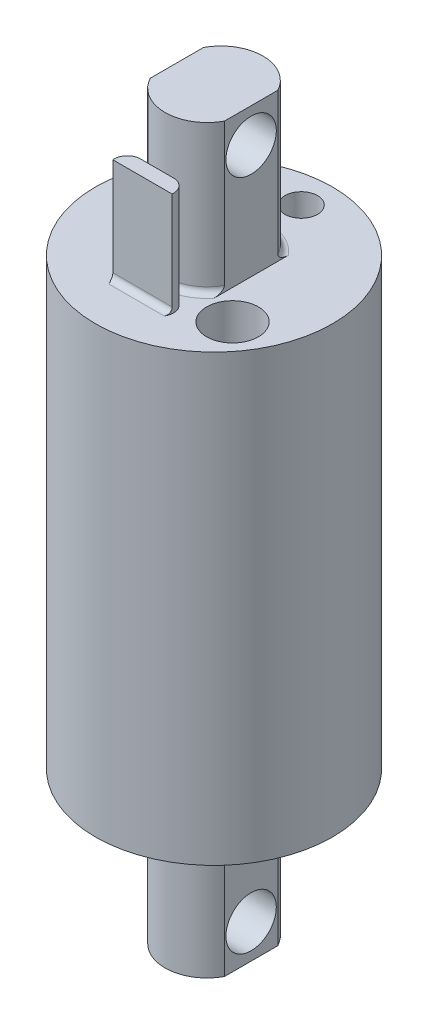
ISO-10303-21;
HEADER;
FILE_DESCRIPTION(('STEP AP214'),'2;1');
FILE_NAME('part.step','',(''),(''),'','','');
FILE_SCHEMA(('AUTOMOTIVE_DESIGN { 1 0 10303 214 1 1 1 1 }'));
ENDSEC;
DATA;
#1=APPLICATION_CONTEXT('core data for automotive mechanical design processes');
#2=APPLICATION_PROTOCOL_DEFINITION('international standard','automotive_design',2000,#1);
#3=PRODUCT_CONTEXT('',#1,'mechanical');
#4=PRODUCT('Part','Part','',(#3));
#5=PRODUCT_RELATED_PRODUCT_CATEGORY('part','',(#4));
#6=PRODUCT_DEFINITION_FORMATION('','',#4);
#7=PRODUCT_DEFINITION_CONTEXT('part definition',#1,'design');
#8=PRODUCT_DEFINITION('design','',#6,#7);
#9=PRODUCT_DEFINITION_SHAPE('','',#8);
#10=(LENGTH_UNIT() NAMED_UNIT(*) SI_UNIT(.MILLI.,.METRE.));
#11=(NAMED_UNIT(*) PLANE_ANGLE_UNIT() SI_UNIT($,.RADIAN.));
#12=(NAMED_UNIT(*) SI_UNIT($,.STERADIAN.) SOLID_ANGLE_UNIT());
#13=UNCERTAINTY_MEASURE_WITH_UNIT(LENGTH_MEASURE(1.E-05),#10,'distance_accuracy_value','');
#14=(GEOMETRIC_REPRESENTATION_CONTEXT(3) GLOBAL_UNCERTAINTY_ASSIGNED_CONTEXT((#13)) GLOBAL_UNIT_ASSIGNED_CONTEXT((#10,
#11,#12)) REPRESENTATION_CONTEXT('',''));
#15=CARTESIAN_POINT('',(0.,0.,0.));
#16=DIRECTION('',(0.,0.,1.));
#17=DIRECTION('',(1.,0.,0.));
#18=AXIS2_PLACEMENT_3D('',#15,#16,#17);
#19=CARTESIAN_POINT('',(0.,30.,0.));
#20=DIRECTION('',(0.,1.,0.));
#21=DIRECTION('',(0.,0.,1.));
#22=AXIS2_PLACEMENT_3D('',#19,#20,#21);
#23=PLANE('',#22);
#24=CARTESIAN_POINT('',(4.51132396785041,30.,3.26045686767382));
#25=DIRECTION('',(0.,1.,0.));
#26=DIRECTION('',(0.,0.,1.));
#27=AXIS2_PLACEMENT_3D('',#24,#25,#26);
#28=CIRCLE('',#27,1.75);
#29=CARTESIAN_POINT('',(4.51132396785041,30.,5.01045686767382));
#30=VERTEX_POINT('',#29);
#31=EDGE_CURVE('E203',#30,#30,#28,.F.);
#32=ORIENTED_EDGE('',*,*,#31,.T.);
#33=EDGE_LOOP('',(#32));
#34=FACE_BOUND('',#33,.T.);
#35=CARTESIAN_POINT('',(0.,30.,-5.88785777853596));
#36=DIRECTION('',(0.,1.,0.));
#37=DIRECTION('',(0.,0.,1.));
#38=AXIS2_PLACEMENT_3D('',#35,#36,#37);
#39=CIRCLE('',#38,1.1);
#40=CARTESIAN_POINT('',(0.,30.,-4.78785777853596));
#41=VERTEX_POINT('',#40);
#42=EDGE_CURVE('E197',#41,#41,#39,.F.);
#43=ORIENTED_EDGE('',*,*,#42,.T.);
#44=EDGE_LOOP('',(#43));
#45=FACE_BOUND('',#44,.T.);
#46=DIRECTION('',(0.,0.,1.));
#47=VECTOR('',#46,1.);
#48=CARTESIAN_POINT('',(-2.50450289239268,30.,1.8));
#49=LINE('',#48,#47);
#50=CARTESIAN_POINT('',(-2.50450289239268,30.,-2.51728401601636));
#51=VERTEX_POINT('',#50);
#52=CARTESIAN_POINT('',(-2.50450289239268,30.,2.51728401601636));
#53=VERTEX_POINT('',#52);
#54=EDGE_CURVE('E233',#51,#53,#49,.T.);
#55=ORIENTED_EDGE('',*,*,#54,.F.);
#56=CARTESIAN_POINT('',(0.,30.,-0.464217512733279));
#57=DIRECTION('',(0.,1.,0.));
#58=DIRECTION('',(0.,0.,1.));
#59=AXIS2_PLACEMENT_3D('',#56,#57,#58);
#60=CIRCLE('',#59,3.23845901701817);
#61=CARTESIAN_POINT('',(2.50450289239268,30.,-2.51728401601636));
#62=VERTEX_POINT('',#61);
#63=EDGE_CURVE('E269',#51,#62,#60,.F.);
#64=ORIENTED_EDGE('',*,*,#63,.T.);
#65=DIRECTION('',(0.,0.,-1.));
#66=VECTOR('',#65,1.);
#67=CARTESIAN_POINT('',(2.50450289239268,30.,1.8));
#68=LINE('',#67,#66);
#69=CARTESIAN_POINT('',(2.50450289239268,30.,2.51728401601636));
#70=VERTEX_POINT('',#69);
#71=EDGE_CURVE('E238',#70,#62,#68,.T.);
#72=ORIENTED_EDGE('',*,*,#71,.F.);
#73=CARTESIAN_POINT('',(0.,30.,0.464217512733279));
#74=DIRECTION('',(0.,1.,0.));
#75=DIRECTION('',(0.,0.,1.));
#76=AXIS2_PLACEMENT_3D('',#73,#74,#75);
#77=CIRCLE('',#76,3.23845901701817);
#78=EDGE_CURVE('E266',#70,#53,#77,.F.);
#79=ORIENTED_EDGE('',*,*,#78,.T.);
#80=EDGE_LOOP('',(#55,#64,#72,#79));
#81=FACE_BOUND('',#80,.T.);
#82=CARTESIAN_POINT('',(0.,30.,0.));
#83=DIRECTION('',(0.,1.,0.));
#84=DIRECTION('',(0.,0.,1.));
#85=AXIS2_PLACEMENT_3D('',#82,#83,#84);
#86=CIRCLE('',#85,8.);
#87=CARTESIAN_POINT('',(0.,30.,8.));
#88=VERTEX_POINT('',#87);
#89=EDGE_CURVE('E258',#88,#88,#86,.T.);
#90=ORIENTED_EDGE('',*,*,#89,.T.);
#91=EDGE_LOOP('',(#90));
#92=FACE_BOUND('',#91,.T.);
#93=CARTESIAN_POINT('',(1.10865637260195,30.,4.73538494762983));
#94=DIRECTION('',(0.,1.,0.));
#95=DIRECTION('',(0.,0.,-1.));
#96=AXIS2_PLACEMENT_3D('',#93,#94,#95);
#97=CIRCLE('',#96,0.896011785842879);
#98=CARTESIAN_POINT('',(1.85793506586946,30.,5.22672857502788));
#99=VERTEX_POINT('',#98);
#100=CARTESIAN_POINT('',(1.2,30.,3.84404132023178));
#101=VERTEX_POINT('',#100);
#102=EDGE_CURVE('E206',#99,#101,#97,.T.);
#103=ORIENTED_EDGE('',*,*,#102,.F.);
#104=DIRECTION('',(1.,0.,0.));
#105=VECTOR('',#104,1.);
#106=CARTESIAN_POINT('',(0.,30.,5.22672857502788));
#107=LINE('',#106,#105);
#108=CARTESIAN_POINT('',(-1.85793506586946,30.,5.22672857502788));
#109=VERTEX_POINT('',#108);
#110=EDGE_CURVE('E272',#99,#109,#107,.F.);
#111=ORIENTED_EDGE('',*,*,#110,.T.);
#112=CARTESIAN_POINT('',(-1.10865637260195,30.,4.73538494762983));
#113=DIRECTION('',(0.,1.,0.));
#114=DIRECTION('',(0.,0.,1.));
#115=AXIS2_PLACEMENT_3D('',#112,#113,#114);
#116=CIRCLE('',#115,0.896011785842879);
#117=CARTESIAN_POINT('',(-1.2,30.,3.84404132023178));
#118=VERTEX_POINT('',#117);
#119=EDGE_CURVE('E211',#118,#109,#116,.T.);
#120=ORIENTED_EDGE('',*,*,#119,.F.);
#121=DIRECTION('',(-1.,0.,0.));
#122=VECTOR('',#121,1.);
#123=CARTESIAN_POINT('',(-1.2,30.,3.84404132023178));
#124=LINE('',#123,#122);
#125=EDGE_CURVE('E220',#101,#118,#124,.T.);
#126=ORIENTED_EDGE('',*,*,#125,.F.);
#127=EDGE_LOOP('',(#103,#111,#120,#126));
#128=FACE_BOUND('',#127,.T.);
#129=ADVANCED_FACE('F43',(#34,#45,#81,#92,#128),#23,.T.);
#130=CARTESIAN_POINT('',(0.,30.,0.));
#131=DIRECTION('',(0.,-1.,0.));
#132=DIRECTION('',(0.,0.,-1.));
#133=AXIS2_PLACEMENT_3D('',#130,#131,#132);
#134=CYLINDRICAL_SURFACE('',#133,8.);
#135=ORIENTED_EDGE('',*,*,#89,.F.);
#136=EDGE_LOOP('',(#135));
#137=FACE_BOUND('',#136,.T.);
#138=CARTESIAN_POINT('',(0.,0.,0.));
#139=DIRECTION('',(0.,1.,0.));
#140=DIRECTION('',(0.,0.,1.));
#141=AXIS2_PLACEMENT_3D('',#138,#139,#140);
#142=CIRCLE('',#141,8.);
#143=CARTESIAN_POINT('',(0.,0.,8.));
#144=VERTEX_POINT('',#143);
#145=EDGE_CURVE('E257',#144,#144,#142,.T.);
#146=ORIENTED_EDGE('',*,*,#145,.T.);
#147=EDGE_LOOP('',(#146));
#148=FACE_BOUND('',#147,.T.);
#149=ADVANCED_FACE('F308',(#137,#148),#134,.T.);
#150=CARTESIAN_POINT('',(0.,0.,0.));
#151=DIRECTION('',(0.,1.,0.));
#152=DIRECTION('',(0.,0.,1.));
#153=AXIS2_PLACEMENT_3D('',#150,#151,#152);
#154=PLANE('',#153);
#155=DIRECTION('',(0.,0.,-1.));
#156=VECTOR('',#155,1.);
#157=CARTESIAN_POINT('',(2.50450289239268,0.,1.8));
#158=LINE('',#157,#156);
#159=CARTESIAN_POINT('',(2.50450289239268,0.,1.8));
#160=VERTEX_POINT('',#159);
#161=CARTESIAN_POINT('',(2.50450289239268,0.,-1.8));
#162=VERTEX_POINT('',#161);
#163=EDGE_CURVE('E180',#160,#162,#158,.T.);
#164=ORIENTED_EDGE('',*,*,#163,.T.);
#165=CARTESIAN_POINT('',(0.,0.,-0.464217512733279));
#166=DIRECTION('',(0.,1.,0.));
#167=DIRECTION('',(0.,0.,-1.));
#168=AXIS2_PLACEMENT_3D('',#165,#166,#167);
#169=CIRCLE('',#168,2.83845901701817);
#170=CARTESIAN_POINT('',(-2.50450289239268,0.,-1.8));
#171=VERTEX_POINT('',#170);
#172=EDGE_CURVE('E60',#162,#171,#169,.T.);
#173=ORIENTED_EDGE('',*,*,#172,.T.);
#174=DIRECTION('',(0.,0.,1.));
#175=VECTOR('',#174,1.);
#176=CARTESIAN_POINT('',(-2.50450289239268,0.,1.8));
#177=LINE('',#176,#175);
#178=CARTESIAN_POINT('',(-2.50450289239268,0.,1.8));
#179=VERTEX_POINT('',#178);
#180=EDGE_CURVE('E169',#171,#179,#177,.T.);
#181=ORIENTED_EDGE('',*,*,#180,.T.);
#182=CARTESIAN_POINT('',(0.,0.,0.464217512733279));
#183=DIRECTION('',(0.,1.,0.));
#184=DIRECTION('',(0.,0.,1.));
#185=AXIS2_PLACEMENT_3D('',#182,#183,#184);
#186=CIRCLE('',#185,2.83845901701817);
#187=EDGE_CURVE('E183',#179,#160,#186,.T.);
#188=ORIENTED_EDGE('',*,*,#187,.T.);
#189=EDGE_LOOP('',(#164,#173,#181,#188));
#190=FACE_BOUND('',#189,.T.);
#191=CARTESIAN_POINT('',(4.51132396785041,0.,3.26045686767382));
#192=DIRECTION('',(0.,1.,0.));
#193=DIRECTION('',(0.,0.,1.));
#194=AXIS2_PLACEMENT_3D('',#191,#192,#193);
#195=CIRCLE('',#194,1.75);
#196=CARTESIAN_POINT('',(4.51132396785041,0.,5.01045686767382));
#197=VERTEX_POINT('',#196);
#198=EDGE_CURVE('E194',#197,#197,#195,.T.);
#199=ORIENTED_EDGE('',*,*,#198,.T.);
#200=EDGE_LOOP('',(#199));
#201=FACE_BOUND('',#200,.T.);
#202=CARTESIAN_POINT('',(0.,0.,-5.88785777853596));
#203=DIRECTION('',(0.,1.,0.));
#204=DIRECTION('',(0.,0.,1.));
#205=AXIS2_PLACEMENT_3D('',#202,#203,#204);
#206=CIRCLE('',#205,1.1);
#207=CARTESIAN_POINT('',(0.,0.,-4.78785777853596));
#208=VERTEX_POINT('',#207);
#209=EDGE_CURVE('E198',#208,#208,#206,.T.);
#210=ORIENTED_EDGE('',*,*,#209,.T.);
#211=EDGE_LOOP('',(#210));
#212=FACE_BOUND('',#211,.T.);
#213=ORIENTED_EDGE('',*,*,#145,.F.);
#214=EDGE_LOOP('',(#213));
#215=FACE_BOUND('',#214,.T.);
#216=ADVANCED_FACE('F356',(#190,#201,#212,#215),#154,.F.);
#217=CARTESIAN_POINT('',(0.,40.,-0.464217512733279));
#218=DIRECTION('',(0.,-1.,0.));
#219=DIRECTION('',(0.,0.,-1.));
#220=AXIS2_PLACEMENT_3D('',#217,#218,#219);
#221=CYLINDRICAL_SURFACE('',#220,2.83845901701817);
#222=DIRECTION('',(0.,-1.,0.));
#223=VECTOR('',#222,1.);
#224=CARTESIAN_POINT('',(2.50450289239268,40.,-1.8));
#225=LINE('',#224,#223);
#226=CARTESIAN_POINT('',(2.50450289239268,40.,-1.8));
#227=VERTEX_POINT('',#226);
#228=CARTESIAN_POINT('',(2.50450289239268,30.4,-1.8));
#229=VERTEX_POINT('',#228);
#230=EDGE_CURVE('E244',#227,#229,#225,.T.);
#231=ORIENTED_EDGE('',*,*,#230,.T.);
#232=CARTESIAN_POINT('',(0.,30.4,-0.464217512733279));
#233=DIRECTION('',(0.,1.,0.));
#234=DIRECTION('',(0.,0.,1.));
#235=AXIS2_PLACEMENT_3D('',#232,#233,#234);
#236=CIRCLE('',#235,2.83845901701817);
#237=CARTESIAN_POINT('',(-2.50450289239268,30.4,-1.8));
#238=VERTEX_POINT('',#237);
#239=EDGE_CURVE('E275',#229,#238,#236,.T.);
#240=ORIENTED_EDGE('',*,*,#239,.T.);
#241=DIRECTION('',(0.,-1.,0.));
#242=VECTOR('',#241,1.);
#243=CARTESIAN_POINT('',(-2.50450289239268,40.,-1.8));
#244=LINE('',#243,#242);
#245=CARTESIAN_POINT('',(-2.50450289239268,40.,-1.8));
#246=VERTEX_POINT('',#245);
#247=EDGE_CURVE('E254',#246,#238,#244,.T.);
#248=ORIENTED_EDGE('',*,*,#247,.F.);
#249=CARTESIAN_POINT('',(0.,40.,-0.464217512733279));
#250=DIRECTION('',(0.,1.,0.));
#251=DIRECTION('',(0.,0.,-1.));
#252=AXIS2_PLACEMENT_3D('',#249,#250,#251);
#253=CIRCLE('',#252,2.83845901701817);
#254=EDGE_CURVE('E234',#227,#246,#253,.T.);
#255=ORIENTED_EDGE('',*,*,#254,.F.);
#256=EDGE_LOOP('',(#231,#240,#248,#255));
#257=FACE_BOUND('',#256,.T.);
#258=ADVANCED_FACE('F347',(#257),#221,.T.);
#259=CARTESIAN_POINT('',(-2.50450289239268,40.,1.8));
#260=DIRECTION('',(1.,0.,0.));
#261=DIRECTION('',(0.,0.,-1.));
#262=AXIS2_PLACEMENT_3D('',#259,#260,#261);
#263=PLANE('',#262);
#264=CARTESIAN_POINT('',(-2.50450289239268,37.692003776928,0.));
#265=DIRECTION('',(-1.,0.,0.));
#266=DIRECTION('',(0.,0.,1.));
#267=AXIS2_PLACEMENT_3D('',#264,#265,#266);
#268=CIRCLE('',#267,1.7);
#269=CARTESIAN_POINT('',(-2.50450289239268,37.692003776928,1.7));
#270=VERTEX_POINT('',#269);
#271=EDGE_CURVE('E158',#270,#270,#268,.T.);
#272=ORIENTED_EDGE('',*,*,#271,.F.);
#273=EDGE_LOOP('',(#272));
#274=FACE_BOUND('',#273,.T.);
#275=ORIENTED_EDGE('',*,*,#54,.T.);
#276=CARTESIAN_POINT('',(-2.50450289239268,30.,2.51728401601636));
#277=CARTESIAN_POINT('',(-2.50450289239268,30.0000119091502,2.48763597261106));
#278=CARTESIAN_POINT('',(-2.50450289239268,30.0013248632277,2.45799915979675));
#279=CARTESIAN_POINT('',(-2.50450289239268,30.0064324937164,2.39892409884417));
#280=CARTESIAN_POINT('',(-2.50450289239268,30.0102283813324,2.36948595470337));
#281=CARTESIAN_POINT('',(-2.50450289239268,30.0202302414476,2.31072590837758));
#282=CARTESIAN_POINT('',(-2.50450289239268,30.0264595665671,2.28140800184618));
#283=CARTESIAN_POINT('',(-2.50450289239268,30.0412936713501,2.22339109634563));
#284=CARTESIAN_POINT('',(-2.50450289239268,30.0498974988054,2.19469185424675));
#285=CARTESIAN_POINT('',(-2.50450289239268,30.0720506522947,2.13090089701376));
#286=CARTESIAN_POINT('',(-2.50450289239268,30.0863019270715,2.0960499096581));
#287=CARTESIAN_POINT('',(-2.50450289239268,30.1190205751786,2.02843998328094));
#288=CARTESIAN_POINT('',(-2.50450289239268,30.1374747778037,1.99567490958765));
#289=CARTESIAN_POINT('',(-2.50450289239268,30.1704849157456,1.94705425277841));
#290=CARTESIAN_POINT('',(-2.50450289239268,30.1832817597905,1.93000771042301));
#291=CARTESIAN_POINT('',(-2.50450289239268,30.2108700956784,1.89758249749441));
#292=CARTESIAN_POINT('',(-2.50450289239268,30.2256596638167,1.88220224386386));
#293=CARTESIAN_POINT('',(-2.50450289239268,30.2529578512422,1.85813242808231));
#294=CARTESIAN_POINT('',(-2.50450289239268,30.2648888176245,1.84879439499782));
#295=CARTESIAN_POINT('',(-2.50450289239268,30.2900242278783,1.83200108191729));
#296=CARTESIAN_POINT('',(-2.50450289239268,30.3032266243411,1.82454284266724));
#297=CARTESIAN_POINT('',(-2.50450289239268,30.3275161186614,1.81371224804725));
#298=CARTESIAN_POINT('',(-2.50450289239268,30.3383551347399,1.8097894502104));
#299=CARTESIAN_POINT('',(-2.50450289239268,30.3605245999364,1.80381838066797));
#300=CARTESIAN_POINT('',(-2.50450289239268,30.3718535385298,1.80176472516575));
#301=CARTESIAN_POINT('',(-2.50450289239268,30.3888306153539,1.80024625051783));
#302=CARTESIAN_POINT('',(-2.50450289239268,30.3944157841118,1.79999415921722));
#303=CARTESIAN_POINT('',(-2.50450289239268,30.4,1.80000000000001));
#304=B_SPLINE_CURVE_WITH_KNOTS('',3,(#276,#277,#278,#279,#280,#281,#282,#283,#284,#285,#286,
#287,#288,#289,#290,#291,#292,#293,#294,#295,#296,#297,#298,#299,#300,#301,#302,#303),
.UNSPECIFIED.,.F.,.F.,(4,2,2,2,2,2,2,2,2,2,2,2,2,4),(0.,0.0888998047214408,0.177843008207776,
0.267661600353651,0.357444226209855,0.470171856861311,0.582550978735654,0.646390291198205,
0.710168411209123,0.755498305250687,0.800756386888013,0.83520313895179,0.869550355160226,
0.886301788353507),.UNSPECIFIED.);
#305=CARTESIAN_POINT('',(-2.50450289239268,30.4,1.8));
#306=VERTEX_POINT('',#305);
#307=EDGE_CURVE('E11',#53,#306,#304,.T.);
#308=ORIENTED_EDGE('',*,*,#307,.T.);
#309=DIRECTION('',(0.,-1.,0.));
#310=VECTOR('',#309,1.);
#311=CARTESIAN_POINT('',(-2.50450289239268,40.,1.8));
#312=LINE('',#311,#310);
#313=CARTESIAN_POINT('',(-2.50450289239268,40.,1.8));
#314=VERTEX_POINT('',#313);
#315=EDGE_CURVE('E252',#314,#306,#312,.T.);
#316=ORIENTED_EDGE('',*,*,#315,.F.);
#317=DIRECTION('',(0.,0.,1.));
#318=VECTOR('',#317,1.);
#319=CARTESIAN_POINT('',(-2.50450289239268,40.,1.8));
#320=LINE('',#319,#318);
#321=EDGE_CURVE('E237',#246,#314,#320,.T.);
#322=ORIENTED_EDGE('',*,*,#321,.F.);
#323=ORIENTED_EDGE('',*,*,#247,.T.);
#324=CARTESIAN_POINT('',(-2.50450289239268,30.4,-1.8));
#325=CARTESIAN_POINT('',(-2.50450289239268,30.3883224968238,-1.79996708188551));
#326=CARTESIAN_POINT('',(-2.50450289239268,30.3766897129056,-1.80108514253851));
#327=CARTESIAN_POINT('',(-2.50450289239268,30.3539337229505,-1.80531305506807));
#328=CARTESIAN_POINT('',(-2.50450289239268,30.3428060018962,-1.80839817418014));
#329=CARTESIAN_POINT('',(-2.50450289239268,30.3182546163447,-1.81732680959828));
#330=CARTESIAN_POINT('',(-2.50450289239268,30.3050237644356,-1.82369063014234));
#331=CARTESIAN_POINT('',(-2.50450289239268,30.2797004068349,-1.8384545043773));
#332=CARTESIAN_POINT('',(-2.50450289239268,30.2676144355421,-1.84686537048883));
#333=CARTESIAN_POINT('',(-2.50450289239268,30.237129055045,-1.87105411093742));
#334=CARTESIAN_POINT('',(-2.50450289239268,30.2197232755302,-1.88807034640401));
#335=CARTESIAN_POINT('',(-2.50450289239268,30.1875488768791,-1.92440347290792));
#336=CARTESIAN_POINT('',(-2.50450289239268,30.1727863900592,-1.94372554480007));
#337=CARTESIAN_POINT('',(-2.50450289239268,30.1463332746778,-1.98257233475991));
#338=CARTESIAN_POINT('',(-2.50450289239268,30.1345068788103,-2.00200576023124));
#339=CARTESIAN_POINT('',(-2.50450289239268,30.1125322335809,-2.04180431948709));
#340=CARTESIAN_POINT('',(-2.50450289239268,30.1023853598902,-2.06217019977269));
#341=CARTESIAN_POINT('',(-2.50450289239268,30.074175660368,-2.12437729419688));
#342=CARTESIAN_POINT('',(-2.50450289239268,30.0583827918871,-2.16726718767176));
#343=CARTESIAN_POINT('',(-2.50450289239268,30.0379173808753,-2.23587570276436));
#344=CARTESIAN_POINT('',(-2.50450289239268,30.0313801151417,-2.26107246599443));
#345=CARTESIAN_POINT('',(-2.50450289239268,30.0201041953502,-2.31187542928136));
#346=CARTESIAN_POINT('',(-2.50450289239268,30.0153656996864,-2.33748166518833));
#347=CARTESIAN_POINT('',(-2.50450289239268,30.0077618723117,-2.38871761495648));
#348=CARTESIAN_POINT('',(-2.50450289239268,30.0048788847987,-2.41434471162453));
#349=CARTESIAN_POINT('',(-2.50450289239268,30.0010013351957,-2.46573986782496));
#350=CARTESIAN_POINT('',(-2.50450289239268,30.0000067325569,-2.49150792431862));
#351=CARTESIAN_POINT('',(-2.50450289239268,30.,-2.51728401601636));
#352=B_SPLINE_CURVE_WITH_KNOTS('',3,(#324,#325,#326,#327,#328,#329,#330,#331,#332,#333,#334,
#335,#336,#337,#338,#339,#340,#341,#342,#343,#344,#345,#346,#347,#348,#349,#350,#351),
.UNSPECIFIED.,.F.,.F.,(4,2,2,2,2,2,2,2,2,2,2,2,2,4),(0.,0.0349069855355052,0.0693834987745115,
0.113182641471088,0.157218351421393,0.229835246160311,0.302618485482591,0.370765949973144,
0.438968959717025,0.57558951753299,0.653635826315925,0.731689006024593,0.808988051220769,
0.886285436572139),.UNSPECIFIED.);
#353=EDGE_CURVE('E315',#238,#51,#352,.T.);
#354=ORIENTED_EDGE('',*,*,#353,.T.);
#355=EDGE_LOOP('',(#275,#308,#316,#322,#323,#354));
#356=FACE_BOUND('',#355,.T.);
#357=ADVANCED_FACE('F342',(#274,#356),#263,.F.);
#358=CARTESIAN_POINT('',(0.,40.,0.464217512733279));
#359=DIRECTION('',(0.,-1.,0.));
#360=DIRECTION('',(0.,0.,-1.));
#361=AXIS2_PLACEMENT_3D('',#358,#359,#360);
#362=CYLINDRICAL_SURFACE('',#361,2.83845901701817);
#363=ORIENTED_EDGE('',*,*,#315,.T.);
#364=CARTESIAN_POINT('',(0.,30.4,0.464217512733279));
#365=DIRECTION('',(0.,1.,0.));
#366=DIRECTION('',(0.,0.,1.));
#367=AXIS2_PLACEMENT_3D('',#364,#365,#366);
#368=CIRCLE('',#367,2.83845901701817);
#369=CARTESIAN_POINT('',(2.50450289239268,30.4,1.8));
#370=VERTEX_POINT('',#369);
#371=EDGE_CURVE('E278',#306,#370,#368,.T.);
#372=ORIENTED_EDGE('',*,*,#371,.T.);
#373=DIRECTION('',(0.,-1.,0.));
#374=VECTOR('',#373,1.);
#375=CARTESIAN_POINT('',(2.50450289239268,40.,1.8));
#376=LINE('',#375,#374);
#377=CARTESIAN_POINT('',(2.50450289239268,40.,1.8));
#378=VERTEX_POINT('',#377);
#379=EDGE_CURVE('E249',#378,#370,#376,.T.);
#380=ORIENTED_EDGE('',*,*,#379,.F.);
#381=CARTESIAN_POINT('',(0.,40.,0.464217512733279));
#382=DIRECTION('',(0.,1.,0.));
#383=DIRECTION('',(0.,0.,1.));
#384=AXIS2_PLACEMENT_3D('',#381,#382,#383);
#385=CIRCLE('',#384,2.83845901701817);
#386=EDGE_CURVE('E240',#314,#378,#385,.T.);
#387=ORIENTED_EDGE('',*,*,#386,.F.);
#388=EDGE_LOOP('',(#363,#372,#380,#387));
#389=FACE_BOUND('',#388,.T.);
#390=ADVANCED_FACE('F338',(#389),#362,.T.);
#391=CARTESIAN_POINT('',(2.50450289239268,40.,1.8));
#392=DIRECTION('',(-1.,0.,0.));
#393=DIRECTION('',(0.,0.,1.));
#394=AXIS2_PLACEMENT_3D('',#391,#392,#393);
#395=PLANE('',#394);
#396=CARTESIAN_POINT('',(2.50450289239268,37.692003776928,0.));
#397=DIRECTION('',(-1.,0.,0.));
#398=DIRECTION('',(0.,0.,1.));
#399=AXIS2_PLACEMENT_3D('',#396,#397,#398);
#400=CIRCLE('',#399,1.7);
#401=CARTESIAN_POINT('',(2.50450289239268,37.692003776928,1.7));
#402=VERTEX_POINT('',#401);
#403=EDGE_CURVE('E48',#402,#402,#400,.T.);
#404=ORIENTED_EDGE('',*,*,#403,.T.);
#405=EDGE_LOOP('',(#404));
#406=FACE_BOUND('',#405,.T.);
#407=ORIENTED_EDGE('',*,*,#71,.T.);
#408=CARTESIAN_POINT('',(2.50450289239268,30.,-2.51728401601636));
#409=CARTESIAN_POINT('',(2.50450289239268,30.0000119091502,-2.48763597261106));
#410=CARTESIAN_POINT('',(2.50450289239268,30.0013248632277,-2.45799915979675));
#411=CARTESIAN_POINT('',(2.50450289239268,30.0064324937164,-2.39892409884417));
#412=CARTESIAN_POINT('',(2.50450289239268,30.0102283813324,-2.36948595470337));
#413=CARTESIAN_POINT('',(2.50450289239268,30.0202302414476,-2.31072590837758));
#414=CARTESIAN_POINT('',(2.50450289239268,30.0264595665671,-2.28140800184618));
#415=CARTESIAN_POINT('',(2.50450289239268,30.0412936713501,-2.22339109634563));
#416=CARTESIAN_POINT('',(2.50450289239268,30.0498974988054,-2.19469185424675));
#417=CARTESIAN_POINT('',(2.50450289239268,30.0720506522947,-2.13090089701376));
#418=CARTESIAN_POINT('',(2.50450289239268,30.0863019270715,-2.0960499096581));
#419=CARTESIAN_POINT('',(2.50450289239268,30.1190205751786,-2.02843998328094));
#420=CARTESIAN_POINT('',(2.50450289239268,30.1374747778037,-1.99567490958765));
#421=CARTESIAN_POINT('',(2.50450289239268,30.1704849157456,-1.94705425277841));
#422=CARTESIAN_POINT('',(2.50450289239268,30.1832817597905,-1.93000771042301));
#423=CARTESIAN_POINT('',(2.50450289239268,30.2108700956784,-1.89758249749441));
#424=CARTESIAN_POINT('',(2.50450289239268,30.2256596638167,-1.88220224386386));
#425=CARTESIAN_POINT('',(2.50450289239268,30.2529578512422,-1.85813242808231));
#426=CARTESIAN_POINT('',(2.50450289239268,30.2648888176245,-1.84879439499782));
#427=CARTESIAN_POINT('',(2.50450289239268,30.2900242278783,-1.83200108191729));
#428=CARTESIAN_POINT('',(2.50450289239268,30.3032266243411,-1.82454284266724));
#429=CARTESIAN_POINT('',(2.50450289239268,30.3275161186614,-1.81371224804725));
#430=CARTESIAN_POINT('',(2.50450289239268,30.3383551347399,-1.8097894502104));
#431=CARTESIAN_POINT('',(2.50450289239268,30.3605245999364,-1.80381838066797));
#432=CARTESIAN_POINT('',(2.50450289239268,30.3718535385298,-1.80176472516575));
#433=CARTESIAN_POINT('',(2.50450289239268,30.3888306153539,-1.80024625051783));
#434=CARTESIAN_POINT('',(2.50450289239268,30.3944157841118,-1.79999415921722));
#435=CARTESIAN_POINT('',(2.50450289239268,30.4,-1.80000000000001));
#436=B_SPLINE_CURVE_WITH_KNOTS('',3,(#408,#409,#410,#411,#412,#413,#414,#415,#416,#417,#418,
#419,#420,#421,#422,#423,#424,#425,#426,#427,#428,#429,#430,#431,#432,#433,#434,#435),
.UNSPECIFIED.,.F.,.F.,(4,2,2,2,2,2,2,2,2,2,2,2,2,4),(0.,0.0888998047214408,0.177843008207776,
0.267661600353651,0.357444226209855,0.470171856861311,0.582550978735654,0.646390291198205,
0.710168411209123,0.755498305250687,0.800756386888013,0.83520313895179,0.869550355160226,
0.886301788353507),.UNSPECIFIED.);
#437=EDGE_CURVE('E322',#62,#229,#436,.T.);
#438=ORIENTED_EDGE('',*,*,#437,.T.);
#439=ORIENTED_EDGE('',*,*,#230,.F.);
#440=DIRECTION('',(0.,0.,-1.));
#441=VECTOR('',#440,1.);
#442=CARTESIAN_POINT('',(2.50450289239268,40.,1.8));
#443=LINE('',#442,#441);
#444=EDGE_CURVE('E242',#378,#227,#443,.T.);
#445=ORIENTED_EDGE('',*,*,#444,.F.);
#446=ORIENTED_EDGE('',*,*,#379,.T.);
#447=CARTESIAN_POINT('',(2.50450289239268,30.4,1.8));
#448=CARTESIAN_POINT('',(2.50450289239268,30.3883224968238,1.79996708188551));
#449=CARTESIAN_POINT('',(2.50450289239268,30.3766897129056,1.80108514253851));
#450=CARTESIAN_POINT('',(2.50450289239268,30.3539337229505,1.80531305506807));
#451=CARTESIAN_POINT('',(2.50450289239268,30.3428060018962,1.80839817418014));
#452=CARTESIAN_POINT('',(2.50450289239268,30.3182546163447,1.81732680959828));
#453=CARTESIAN_POINT('',(2.50450289239268,30.3050237644356,1.82369063014234));
#454=CARTESIAN_POINT('',(2.50450289239268,30.2797004068349,1.8384545043773));
#455=CARTESIAN_POINT('',(2.50450289239268,30.2676144355421,1.84686537048883));
#456=CARTESIAN_POINT('',(2.50450289239268,30.237129055045,1.87105411093742));
#457=CARTESIAN_POINT('',(2.50450289239268,30.2197232755302,1.88807034640401));
#458=CARTESIAN_POINT('',(2.50450289239268,30.1875488768791,1.92440347290792));
#459=CARTESIAN_POINT('',(2.50450289239268,30.1727863900592,1.94372554480007));
#460=CARTESIAN_POINT('',(2.50450289239268,30.1463332746778,1.98257233475991));
#461=CARTESIAN_POINT('',(2.50450289239268,30.1345068788103,2.00200576023124));
#462=CARTESIAN_POINT('',(2.50450289239268,30.1125322335809,2.04180431948709));
#463=CARTESIAN_POINT('',(2.50450289239268,30.1023853598902,2.06217019977269));
#464=CARTESIAN_POINT('',(2.50450289239268,30.074175660368,2.12437729419688));
#465=CARTESIAN_POINT('',(2.50450289239268,30.0583827918871,2.16726718767176));
#466=CARTESIAN_POINT('',(2.50450289239268,30.0379173808753,2.23587570276436));
#467=CARTESIAN_POINT('',(2.50450289239268,30.0313801151417,2.26107246599443));
#468=CARTESIAN_POINT('',(2.50450289239268,30.0201041953502,2.31187542928136));
#469=CARTESIAN_POINT('',(2.50450289239268,30.0153656996864,2.33748166518833));
#470=CARTESIAN_POINT('',(2.50450289239268,30.0077618723117,2.38871761495648));
#471=CARTESIAN_POINT('',(2.50450289239268,30.0048788847987,2.41434471162453));
#472=CARTESIAN_POINT('',(2.50450289239268,30.0010013351957,2.46573986782496));
#473=CARTESIAN_POINT('',(2.50450289239268,30.0000067325569,2.49150792431862));
#474=CARTESIAN_POINT('',(2.50450289239268,30.,2.51728401601636));
#475=B_SPLINE_CURVE_WITH_KNOTS('',3,(#447,#448,#449,#450,#451,#452,#453,#454,#455,#456,#457,
#458,#459,#460,#461,#462,#463,#464,#465,#466,#467,#468,#469,#470,#471,#472,#473,#474),
.UNSPECIFIED.,.F.,.F.,(4,2,2,2,2,2,2,2,2,2,2,2,2,4),(0.,0.0349069855355052,0.0693834987745115,
0.113182641471088,0.157218351421393,0.229835246160311,0.302618485482591,0.370765949973144,
0.438968959717025,0.57558951753299,0.653635826315925,0.731689006024593,0.808988051220769,
0.886285436572139),.UNSPECIFIED.);
#476=EDGE_CURVE('E53',#370,#70,#475,.T.);
#477=ORIENTED_EDGE('',*,*,#476,.T.);
#478=EDGE_LOOP('',(#407,#438,#439,#445,#446,#477));
#479=FACE_BOUND('',#478,.T.);
#480=ADVANCED_FACE('F333',(#406,#479),#395,.F.);
#481=CARTESIAN_POINT('',(0.,40.,-0.464217512733279));
#482=DIRECTION('',(0.,-1.,0.));
#483=DIRECTION('',(0.,0.,-1.));
#484=AXIS2_PLACEMENT_3D('',#481,#482,#483);
#485=PLANE('',#484);
#486=ORIENTED_EDGE('',*,*,#254,.T.);
#487=ORIENTED_EDGE('',*,*,#321,.T.);
#488=ORIENTED_EDGE('',*,*,#386,.T.);
#489=ORIENTED_EDGE('',*,*,#444,.T.);
#490=EDGE_LOOP('',(#486,#487,#488,#489));
#491=FACE_BOUND('',#490,.T.);
#492=ADVANCED_FACE('F337',(#491),#485,.F.);
#493=CARTESIAN_POINT('',(1.10865637260195,37.,4.73538494762983));
#494=DIRECTION('',(0.,-1.,0.));
#495=DIRECTION('',(0.,0.,-1.));
#496=AXIS2_PLACEMENT_3D('',#493,#494,#495);
#497=CYLINDRICAL_SURFACE('',#496,0.896011785842879);
#498=ORIENTED_EDGE('',*,*,#102,.T.);
#499=DIRECTION('',(0.,-1.,0.));
#500=VECTOR('',#499,1.);
#501=CARTESIAN_POINT('',(1.2,37.,3.84404132023178));
#502=LINE('',#501,#500);
#503=CARTESIAN_POINT('',(1.2,37.,3.84404132023178));
#504=VERTEX_POINT('',#503);
#505=EDGE_CURVE('E231',#504,#101,#502,.T.);
#506=ORIENTED_EDGE('',*,*,#505,.F.);
#507=CARTESIAN_POINT('',(1.10865637260195,37.,4.73538494762983));
#508=DIRECTION('',(0.,1.,0.));
#509=DIRECTION('',(0.,0.,-1.));
#510=AXIS2_PLACEMENT_3D('',#507,#508,#509);
#511=CIRCLE('',#510,0.896011785842879);
#512=CARTESIAN_POINT('',(2.,37.,4.82672857502788));
#513=VERTEX_POINT('',#512);
#514=EDGE_CURVE('E207',#513,#504,#511,.T.);
#515=ORIENTED_EDGE('',*,*,#514,.F.);
#516=DIRECTION('',(0.,-1.,0.));
#517=VECTOR('',#516,1.);
#518=CARTESIAN_POINT('',(2.,37.,4.82672857502788));
#519=LINE('',#518,#517);
#520=CARTESIAN_POINT('',(2.,30.4,4.82672857502788));
#521=VERTEX_POINT('',#520);
#522=EDGE_CURVE('E217',#513,#521,#519,.T.);
#523=ORIENTED_EDGE('',*,*,#522,.T.);
#524=CARTESIAN_POINT('',(2.,30.4,4.82672857502788));
#525=CARTESIAN_POINT('',(1.99997833341264,30.3777389306625,4.82670869341223));
#526=CARTESIAN_POINT('',(1.9998092233502,30.3554810284875,4.82858576690251));
#527=CARTESIAN_POINT('',(1.99901608547039,30.3115934045325,4.83599192771007));
#528=CARTESIAN_POINT('',(1.99839214021118,30.2899635694915,4.84152035224535));
#529=CARTESIAN_POINT('',(1.99652872321578,30.2479299185278,4.85609278071487));
#530=CARTESIAN_POINT('',(1.99528879829417,30.227527017687,4.86513937195105));
#531=CARTESIAN_POINT('',(1.99190739188163,30.1885649771026,4.88645266011637));
#532=CARTESIAN_POINT('',(1.9897661745855,30.1700052990259,4.89871841302002));
#533=CARTESIAN_POINT('',(1.98429059281067,30.1354803062355,4.92588614647499));
#534=CARTESIAN_POINT('',(1.98097046956689,30.1194871984319,4.94075563160951));
#535=CARTESIAN_POINT('',(1.97283738365304,30.0902986976799,4.9726577127438));
#536=CARTESIAN_POINT('',(1.96802540467834,30.077101470816,4.9896888790231));
#537=CARTESIAN_POINT('',(1.95684195378868,30.0541029852659,5.02477760617675));
#538=CARTESIAN_POINT('',(1.95051351610092,30.0442235025652,5.04279777433923));
#539=CARTESIAN_POINT('',(1.93615576555919,30.0274986020267,5.07958338579101));
#540=CARTESIAN_POINT('',(1.92812408730645,30.0206574450174,5.09834983573297));
#541=CARTESIAN_POINT('',(1.91052856144931,30.0100161306264,5.13570605901739));
#542=CARTESIAN_POINT('',(1.90098475345141,30.0061796391409,5.15429516979412));
#543=CARTESIAN_POINT('',(1.88048266442883,30.0011679941113,5.19098521150152));
#544=CARTESIAN_POINT('',(1.86952834566231,29.9999855503931,5.2090873444209));
#545=CARTESIAN_POINT('',(1.85793506586946,30.,5.22672857502788));
#546=B_SPLINE_CURVE_WITH_KNOTS('',3,(#524,#525,#526,#527,#528,#529,#530,#531,#532,#533,#534,
#535,#536,#537,#538,#539,#540,#541,#542,#543,#544,#545),.UNSPECIFIED.,.F.,.F.,(4,2,2,2,2,2,2,2,
2,2,4),(0.,0.0666995626602571,0.133387021547576,0.200123616216006,0.266840662071865,
0.332777746274685,0.398671445218574,0.462879811614476,0.527177939155337,0.590685987413429,
0.654019376317188),.UNSPECIFIED.);
#547=EDGE_CURVE('E281',#521,#99,#546,.T.);
#548=ORIENTED_EDGE('',*,*,#547,.T.);
#549=EDGE_LOOP('',(#498,#506,#515,#523,#548));
#550=FACE_BOUND('',#549,.T.);
#551=ADVANCED_FACE('F297',(#550),#497,.T.);
#552=CARTESIAN_POINT('',(-1.2,37.,3.84404132023178));
#553=DIRECTION('',(0.,0.,1.));
#554=DIRECTION('',(1.,0.,0.));
#555=AXIS2_PLACEMENT_3D('',#552,#553,#554);
#556=PLANE('',#555);
#557=ORIENTED_EDGE('',*,*,#125,.T.);
#558=DIRECTION('',(0.,-1.,0.));
#559=VECTOR('',#558,1.);
#560=CARTESIAN_POINT('',(-1.2,37.,3.84404132023178));
#561=LINE('',#560,#559);
#562=CARTESIAN_POINT('',(-1.2,37.,3.84404132023178));
#563=VERTEX_POINT('',#562);
#564=EDGE_CURVE('E228',#563,#118,#561,.T.);
#565=ORIENTED_EDGE('',*,*,#564,.F.);
#566=DIRECTION('',(-1.,0.,0.));
#567=VECTOR('',#566,1.);
#568=CARTESIAN_POINT('',(-1.2,37.,3.84404132023178));
#569=LINE('',#568,#567);
#570=EDGE_CURVE('E210',#504,#563,#569,.T.);
#571=ORIENTED_EDGE('',*,*,#570,.F.);
#572=ORIENTED_EDGE('',*,*,#505,.T.);
#573=EDGE_LOOP('',(#557,#565,#571,#572));
#574=FACE_BOUND('',#573,.T.);
#575=ADVANCED_FACE('F401',(#574),#556,.F.);
#576=CARTESIAN_POINT('',(-1.10865637260195,37.,4.73538494762983));
#577=DIRECTION('',(0.,-1.,0.));
#578=DIRECTION('',(0.,0.,-1.));
#579=AXIS2_PLACEMENT_3D('',#576,#577,#578);
#580=CYLINDRICAL_SURFACE('',#579,0.896011785842879);
#581=ORIENTED_EDGE('',*,*,#119,.T.);
#582=CARTESIAN_POINT('',(-1.85793506586946,30.,5.22672857502788));
#583=CARTESIAN_POINT('',(-1.87096325734361,29.9999743102314,5.20692395769402));
#584=CARTESIAN_POINT('',(-1.88317796118744,30.0014722787947,5.18652075378953));
#585=CARTESIAN_POINT('',(-1.9058079001453,30.0078482995306,5.1451742255557));
#586=CARTESIAN_POINT('',(-1.91621739381704,30.0127368977124,5.12422941286001));
#587=CARTESIAN_POINT('',(-1.93502587502679,30.026263895873,5.08248856095575));
#588=CARTESIAN_POINT('',(-1.9434148698036,30.0349203620488,5.06169373546447));
#589=CARTESIAN_POINT('',(-1.95807784580394,30.0559970070081,5.02135576359138));
#590=CARTESIAN_POINT('',(-1.96435648890002,30.0684087732544,5.00180993656674));
#591=CARTESIAN_POINT('',(-1.97453350496436,30.0954989004342,4.96647656617222));
#592=CARTESIAN_POINT('',(-1.97859178142694,30.1098849414825,4.95050990057495));
#593=CARTESIAN_POINT('',(-1.98537124485276,30.1412143577068,4.92096097758051));
#594=CARTESIAN_POINT('',(-1.98809157132533,30.1581593695308,4.90738025828265));
#595=CARTESIAN_POINT('',(-1.99246598767278,30.193876218834,4.88325869729049));
#596=CARTESIAN_POINT('',(-1.99413370233215,30.2126209337837,4.87268002959044));
#597=CARTESIAN_POINT('',(-1.9967413260811,30.2516028514708,4.85465431151646));
#598=CARTESIAN_POINT('',(-1.9976814157193,30.2718396825973,4.84720648448371));
#599=CARTESIAN_POINT('',(-1.99895172990246,30.3100124507211,4.83656058719585));
#600=CARTESIAN_POINT('',(-1.99935432256094,30.3278134812597,4.83288015328068));
#601=CARTESIAN_POINT('',(-1.99987348714025,30.3637414640159,4.82796128395143));
#602=CARTESIAN_POINT('',(-1.99999025304978,30.3818681867671,4.82672119240543));
#603=CARTESIAN_POINT('',(-2.,30.4,4.82672857502788));
#604=B_SPLINE_CURVE_WITH_KNOTS('',3,(#582,#583,#584,#585,#586,#587,#588,#589,#590,#591,#592,
#593,#594,#595,#596,#597,#598,#599,#600,#601,#602,#603),.UNSPECIFIED.,.F.,.F.,(4,2,2,2,2,2,2,2,
2,2,4),(0.,0.0711297458273873,0.14248172730037,0.214179662786953,0.285718156701871,
0.351013720279501,0.416351223384473,0.48082466480383,0.545282103026686,0.599662334795988,
0.654005648819596),.UNSPECIFIED.);
#605=CARTESIAN_POINT('',(-2.,30.4,4.82672857502788));
#606=VERTEX_POINT('',#605);
#607=EDGE_CURVE('E290',#109,#606,#604,.T.);
#608=ORIENTED_EDGE('',*,*,#607,.T.);
#609=DIRECTION('',(0.,-1.,0.));
#610=VECTOR('',#609,1.);
#611=CARTESIAN_POINT('',(-2.,37.,4.82672857502788));
#612=LINE('',#611,#610);
#613=CARTESIAN_POINT('',(-2.,37.,4.82672857502788));
#614=VERTEX_POINT('',#613);
#615=EDGE_CURVE('E225',#614,#606,#612,.T.);
#616=ORIENTED_EDGE('',*,*,#615,.F.);
#617=CARTESIAN_POINT('',(-1.10865637260195,37.,4.73538494762983));
#618=DIRECTION('',(0.,1.,0.));
#619=DIRECTION('',(0.,0.,1.));
#620=AXIS2_PLACEMENT_3D('',#617,#618,#619);
#621=CIRCLE('',#620,0.896011785842879);
#622=EDGE_CURVE('E213',#563,#614,#621,.T.);
#623=ORIENTED_EDGE('',*,*,#622,.F.);
#624=ORIENTED_EDGE('',*,*,#564,.T.);
#625=EDGE_LOOP('',(#581,#608,#616,#623,#624));
#626=FACE_BOUND('',#625,.T.);
#627=ADVANCED_FACE('F397',(#626),#580,.T.);
#628=CARTESIAN_POINT('',(-2.,37.,4.82672857502788));
#629=DIRECTION('',(0.,0.,-1.));
#630=DIRECTION('',(-1.,0.,0.));
#631=AXIS2_PLACEMENT_3D('',#628,#629,#630);
#632=PLANE('',#631);
#633=ORIENTED_EDGE('',*,*,#615,.T.);
#634=DIRECTION('',(1.,0.,0.));
#635=VECTOR('',#634,1.);
#636=CARTESIAN_POINT('',(-2.,30.4,4.82672857502788));
#637=LINE('',#636,#635);
#638=EDGE_CURVE('E261',#606,#521,#637,.T.);
#639=ORIENTED_EDGE('',*,*,#638,.T.);
#640=ORIENTED_EDGE('',*,*,#522,.F.);
#641=DIRECTION('',(1.,0.,0.));
#642=VECTOR('',#641,1.);
#643=CARTESIAN_POINT('',(-2.,37.,4.82672857502788));
#644=LINE('',#643,#642);
#645=EDGE_CURVE('E215',#614,#513,#644,.T.);
#646=ORIENTED_EDGE('',*,*,#645,.F.);
#647=EDGE_LOOP('',(#633,#639,#640,#646));
#648=FACE_BOUND('',#647,.T.);
#649=ADVANCED_FACE('F394',(#648),#632,.F.);
#650=CARTESIAN_POINT('',(1.10865637260195,37.,4.73538494762983));
#651=DIRECTION('',(0.,-1.,0.));
#652=DIRECTION('',(0.,0.,-1.));
#653=AXIS2_PLACEMENT_3D('',#650,#651,#652);
#654=PLANE('',#653);
#655=ORIENTED_EDGE('',*,*,#514,.T.);
#656=ORIENTED_EDGE('',*,*,#570,.T.);
#657=ORIENTED_EDGE('',*,*,#622,.T.);
#658=ORIENTED_EDGE('',*,*,#645,.T.);
#659=EDGE_LOOP('',(#655,#656,#657,#658));
#660=FACE_BOUND('',#659,.T.);
#661=ADVANCED_FACE('F306',(#660),#654,.F.);
#662=CARTESIAN_POINT('',(-2.,30.4,5.22672857502788));
#663=DIRECTION('',(1.,0.,0.));
#664=DIRECTION('',(0.,0.,-1.));
#665=AXIS2_PLACEMENT_3D('',#662,#663,#664);
#666=CYLINDRICAL_SURFACE('',#665,0.4);
#667=ORIENTED_EDGE('',*,*,#607,.F.);
#668=ORIENTED_EDGE('',*,*,#110,.F.);
#669=ORIENTED_EDGE('',*,*,#547,.F.);
#670=ORIENTED_EDGE('',*,*,#638,.F.);
#671=EDGE_LOOP('',(#667,#668,#669,#670));
#672=FACE_BOUND('',#671,.T.);
#673=ADVANCED_FACE('F301',(#672),#666,.F.);
#674=CARTESIAN_POINT('',(0.,30.4,-0.464217512733279));
#675=DIRECTION('',(0.,1.,0.));
#676=DIRECTION('',(0.,0.,1.));
#677=AXIS2_PLACEMENT_3D('',#674,#675,#676);
#678=TOROIDAL_SURFACE('',#677,3.23845901701817,0.4);
#679=ORIENTED_EDGE('',*,*,#437,.F.);
#680=ORIENTED_EDGE('',*,*,#63,.F.);
#681=ORIENTED_EDGE('',*,*,#353,.F.);
#682=ORIENTED_EDGE('',*,*,#239,.F.);
#683=EDGE_LOOP('',(#679,#680,#681,#682));
#684=FACE_BOUND('',#683,.T.);
#685=ADVANCED_FACE('F305',(#684),#678,.F.);
#686=CARTESIAN_POINT('',(0.,30.4,0.464217512733279));
#687=DIRECTION('',(0.,1.,0.));
#688=DIRECTION('',(0.,0.,1.));
#689=AXIS2_PLACEMENT_3D('',#686,#687,#688);
#690=TOROIDAL_SURFACE('',#689,3.23845901701817,0.4);
#691=ORIENTED_EDGE('',*,*,#307,.F.);
#692=ORIENTED_EDGE('',*,*,#78,.F.);
#693=ORIENTED_EDGE('',*,*,#476,.F.);
#694=ORIENTED_EDGE('',*,*,#371,.F.);
#695=EDGE_LOOP('',(#691,#692,#693,#694));
#696=FACE_BOUND('',#695,.T.);
#697=ADVANCED_FACE('F45',(#696),#690,.F.);
#698=CARTESIAN_POINT('',(0.,40.,-5.88785777853596));
#699=DIRECTION('',(0.,-1.,0.));
#700=DIRECTION('',(0.,0.,-1.));
#701=AXIS2_PLACEMENT_3D('',#698,#699,#700);
#702=CYLINDRICAL_SURFACE('',#701,1.1);
#703=ORIENTED_EDGE('',*,*,#42,.F.);
#704=EDGE_LOOP('',(#703));
#705=FACE_BOUND('',#704,.T.);
#706=ORIENTED_EDGE('',*,*,#209,.F.);
#707=EDGE_LOOP('',(#706));
#708=FACE_BOUND('',#707,.T.);
#709=ADVANCED_FACE('F376',(#705,#708),#702,.F.);
#710=CARTESIAN_POINT('',(4.51132396785041,40.,3.26045686767382));
#711=DIRECTION('',(0.,-1.,0.));
#712=DIRECTION('',(0.,0.,-1.));
#713=AXIS2_PLACEMENT_3D('',#710,#711,#712);
#714=CYLINDRICAL_SURFACE('',#713,1.75);
#715=ORIENTED_EDGE('',*,*,#31,.F.);
#716=EDGE_LOOP('',(#715));
#717=FACE_BOUND('',#716,.T.);
#718=ORIENTED_EDGE('',*,*,#198,.F.);
#719=EDGE_LOOP('',(#718));
#720=FACE_BOUND('',#719,.T.);
#721=ADVANCED_FACE('F378',(#717,#720),#714,.F.);
#722=CARTESIAN_POINT('',(8.,37.692003776928,0.));
#723=DIRECTION('',(-1.,0.,0.));
#724=DIRECTION('',(0.,0.,1.));
#725=AXIS2_PLACEMENT_3D('',#722,#723,#724);
#726=CYLINDRICAL_SURFACE('',#725,1.7);
#727=ORIENTED_EDGE('',*,*,#271,.T.);
#728=EDGE_LOOP('',(#727));
#729=FACE_BOUND('',#728,.T.);
#730=ORIENTED_EDGE('',*,*,#403,.F.);
#731=EDGE_LOOP('',(#730));
#732=FACE_BOUND('',#731,.T.);
#733=ADVANCED_FACE('F384',(#729,#732),#726,.F.);
#734=CARTESIAN_POINT('',(0.,-10.,-0.464217512733279));
#735=DIRECTION('',(0.,1.,0.));
#736=DIRECTION('',(0.,0.,1.));
#737=AXIS2_PLACEMENT_3D('',#734,#735,#736);
#738=CYLINDRICAL_SURFACE('',#737,2.83845901701817);
#739=ORIENTED_EDGE('',*,*,#172,.F.);
#740=DIRECTION('',(0.,1.,0.));
#741=VECTOR('',#740,1.);
#742=CARTESIAN_POINT('',(2.50450289239268,-10.,-1.8));
#743=LINE('',#742,#741);
#744=CARTESIAN_POINT('',(2.50450289239268,-10.,-1.8));
#745=VERTEX_POINT('',#744);
#746=EDGE_CURVE('E149',#745,#162,#743,.T.);
#747=ORIENTED_EDGE('',*,*,#746,.F.);
#748=CARTESIAN_POINT('',(0.,-10.,-0.464217512733279));
#749=DIRECTION('',(0.,1.,0.));
#750=DIRECTION('',(0.,0.,-1.));
#751=AXIS2_PLACEMENT_3D('',#748,#749,#750);
#752=CIRCLE('',#751,2.83845901701817);
#753=CARTESIAN_POINT('',(-2.50450289239268,-10.,-1.8));
#754=VERTEX_POINT('',#753);
#755=EDGE_CURVE('E152',#745,#754,#752,.T.);
#756=ORIENTED_EDGE('',*,*,#755,.T.);
#757=DIRECTION('',(0.,1.,0.));
#758=VECTOR('',#757,1.);
#759=CARTESIAN_POINT('',(-2.50450289239268,-10.,-1.8));
#760=LINE('',#759,#758);
#761=EDGE_CURVE('E178',#754,#171,#760,.T.);
#762=ORIENTED_EDGE('',*,*,#761,.T.);
#763=EDGE_LOOP('',(#739,#747,#756,#762));
#764=FACE_BOUND('',#763,.T.);
#765=ADVANCED_FACE('F151',(#764),#738,.T.);
#766=CARTESIAN_POINT('',(2.50450289239268,-10.,1.8));
#767=DIRECTION('',(1.,0.,0.));
#768=DIRECTION('',(0.,0.,-1.));
#769=AXIS2_PLACEMENT_3D('',#766,#767,#768);
#770=PLANE('',#769);
#771=CARTESIAN_POINT('',(2.50450289239268,-7.69200377692803,0.));
#772=DIRECTION('',(1.,0.,0.));
#773=DIRECTION('',(0.,0.,-1.));
#774=AXIS2_PLACEMENT_3D('',#771,#772,#773);
#775=CIRCLE('',#774,1.7);
#776=CARTESIAN_POINT('',(2.50450289239268,-7.69200377692803,-1.7));
#777=VERTEX_POINT('',#776);
#778=EDGE_CURVE('E181',#777,#777,#775,.F.);
#779=ORIENTED_EDGE('',*,*,#778,.T.);
#780=EDGE_LOOP('',(#779));
#781=FACE_BOUND('',#780,.T.);
#782=ORIENTED_EDGE('',*,*,#163,.F.);
#783=DIRECTION('',(0.,1.,0.));
#784=VECTOR('',#783,1.);
#785=CARTESIAN_POINT('',(2.50450289239268,-10.,1.8));
#786=LINE('',#785,#784);
#787=CARTESIAN_POINT('',(2.50450289239268,-10.,1.8));
#788=VERTEX_POINT('',#787);
#789=EDGE_CURVE('E159',#788,#160,#786,.T.);
#790=ORIENTED_EDGE('',*,*,#789,.F.);
#791=DIRECTION('',(0.,0.,-1.));
#792=VECTOR('',#791,1.);
#793=CARTESIAN_POINT('',(2.50450289239268,-10.,1.8));
#794=LINE('',#793,#792);
#795=EDGE_CURVE('E165',#788,#745,#794,.T.);
#796=ORIENTED_EDGE('',*,*,#795,.T.);
#797=ORIENTED_EDGE('',*,*,#746,.T.);
#798=EDGE_LOOP('',(#782,#790,#796,#797));
#799=FACE_BOUND('',#798,.T.);
#800=ADVANCED_FACE('F171',(#781,#799),#770,.T.);
#801=CARTESIAN_POINT('',(0.,-10.,0.464217512733279));
#802=DIRECTION('',(0.,1.,0.));
#803=DIRECTION('',(0.,0.,1.));
#804=AXIS2_PLACEMENT_3D('',#801,#802,#803);
#805=CYLINDRICAL_SURFACE('',#804,2.83845901701817);
#806=ORIENTED_EDGE('',*,*,#187,.F.);
#807=DIRECTION('',(0.,1.,0.));
#808=VECTOR('',#807,1.);
#809=CARTESIAN_POINT('',(-2.50450289239268,-10.,1.8));
#810=LINE('',#809,#808);
#811=CARTESIAN_POINT('',(-2.50450289239268,-10.,1.8));
#812=VERTEX_POINT('',#811);
#813=EDGE_CURVE('E189',#812,#179,#810,.T.);
#814=ORIENTED_EDGE('',*,*,#813,.F.);
#815=CARTESIAN_POINT('',(0.,-10.,0.464217512733279));
#816=DIRECTION('',(0.,1.,0.));
#817=DIRECTION('',(0.,0.,1.));
#818=AXIS2_PLACEMENT_3D('',#815,#816,#817);
#819=CIRCLE('',#818,2.83845901701817);
#820=EDGE_CURVE('E172',#812,#788,#819,.T.);
#821=ORIENTED_EDGE('',*,*,#820,.T.);
#822=ORIENTED_EDGE('',*,*,#789,.T.);
#823=EDGE_LOOP('',(#806,#814,#821,#822));
#824=FACE_BOUND('',#823,.T.);
#825=ADVANCED_FACE('F501',(#824),#805,.T.);
#826=CARTESIAN_POINT('',(-2.50450289239268,-10.,1.8));
#827=DIRECTION('',(-1.,0.,0.));
#828=DIRECTION('',(0.,0.,1.));
#829=AXIS2_PLACEMENT_3D('',#826,#827,#828);
#830=PLANE('',#829);
#831=CARTESIAN_POINT('',(-2.50450289239268,-7.69200377692803,0.));
#832=DIRECTION('',(1.,0.,0.));
#833=DIRECTION('',(0.,0.,1.));
#834=AXIS2_PLACEMENT_3D('',#831,#832,#833);
#835=CIRCLE('',#834,1.7);
#836=CARTESIAN_POINT('',(-2.50450289239268,-7.69200377692803,1.7));
#837=VERTEX_POINT('',#836);
#838=EDGE_CURVE('E547',#837,#837,#835,.T.);
#839=ORIENTED_EDGE('',*,*,#838,.T.);
#840=EDGE_LOOP('',(#839));
#841=FACE_BOUND('',#840,.T.);
#842=ORIENTED_EDGE('',*,*,#180,.F.);
#843=ORIENTED_EDGE('',*,*,#761,.F.);
#844=DIRECTION('',(0.,0.,1.));
#845=VECTOR('',#844,1.);
#846=CARTESIAN_POINT('',(-2.50450289239268,-10.,1.8));
#847=LINE('',#846,#845);
#848=EDGE_CURVE('E168',#754,#812,#847,.T.);
#849=ORIENTED_EDGE('',*,*,#848,.T.);
#850=ORIENTED_EDGE('',*,*,#813,.T.);
#851=EDGE_LOOP('',(#842,#843,#849,#850));
#852=FACE_BOUND('',#851,.T.);
#853=ADVANCED_FACE('F511',(#841,#852),#830,.T.);
#854=CARTESIAN_POINT('',(0.,-10.,-0.464217512733279));
#855=DIRECTION('',(0.,1.,0.));
#856=DIRECTION('',(0.,0.,-1.));
#857=AXIS2_PLACEMENT_3D('',#854,#855,#856);
#858=PLANE('',#857);
#859=ORIENTED_EDGE('',*,*,#755,.F.);
#860=ORIENTED_EDGE('',*,*,#795,.F.);
#861=ORIENTED_EDGE('',*,*,#820,.F.);
#862=ORIENTED_EDGE('',*,*,#848,.F.);
#863=EDGE_LOOP('',(#859,#860,#861,#862));
#864=FACE_BOUND('',#863,.T.);
#865=ADVANCED_FACE('F163',(#864),#858,.F.);
#866=CARTESIAN_POINT('',(8.,-7.69200377692803,0.));
#867=DIRECTION('',(-1.,0.,0.));
#868=DIRECTION('',(0.,0.,1.));
#869=AXIS2_PLACEMENT_3D('',#866,#867,#868);
#870=CYLINDRICAL_SURFACE('',#869,1.7);
#871=ORIENTED_EDGE('',*,*,#778,.F.);
#872=EDGE_LOOP('',(#871));
#873=FACE_BOUND('',#872,.T.);
#874=ORIENTED_EDGE('',*,*,#838,.F.);
#875=EDGE_LOOP('',(#874));
#876=FACE_BOUND('',#875,.T.);
#877=ADVANCED_FACE('F530',(#873,#876),#870,.F.);
#878=CLOSED_SHELL('',(#129,#149,#216,#258,#357,#390,#480,#492,#551,#575,#627,#649,#661,#673,
#685,#697,#709,#721,#733,#765,#800,#825,#853,#865,#877));
#879=MANIFOLD_SOLID_BREP('B2',#878);
#880=ADVANCED_BREP_SHAPE_REPRESENTATION('',(#18,#879),#14);
#881=SHAPE_DEFINITION_REPRESENTATION(#9,#880);
ENDSEC;
END-ISO-10303-21;
